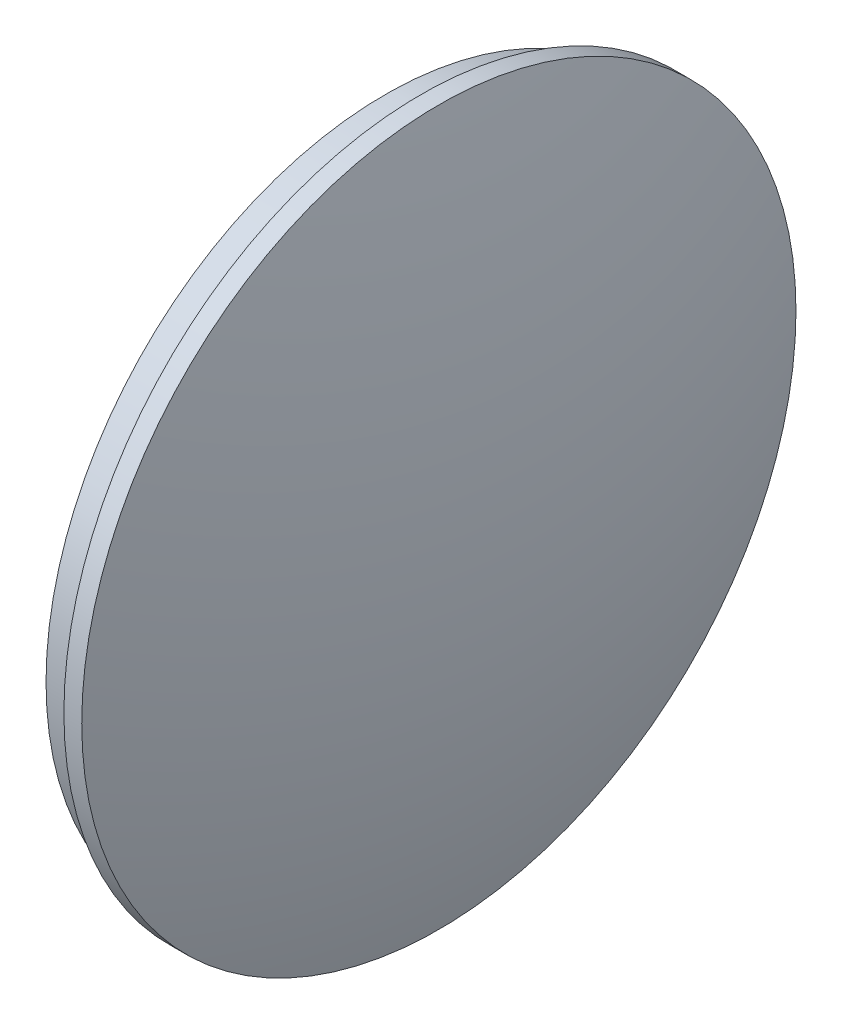
ISO-10303-21;
HEADER;
FILE_DESCRIPTION(('STEP AP214'),'2;1');
FILE_NAME('part.step','',(''),(''),'','','');
FILE_SCHEMA(('AUTOMOTIVE_DESIGN { 1 0 10303 214 1 1 1 1 }'));
ENDSEC;
DATA;
#1=APPLICATION_CONTEXT('core data for automotive mechanical design processes');
#2=APPLICATION_PROTOCOL_DEFINITION('international standard','automotive_design',2000,#1);
#3=PRODUCT_CONTEXT('',#1,'mechanical');
#4=PRODUCT('Part','Part','',(#3));
#5=PRODUCT_RELATED_PRODUCT_CATEGORY('part','',(#4));
#6=PRODUCT_DEFINITION_FORMATION('','',#4);
#7=PRODUCT_DEFINITION_CONTEXT('part definition',#1,'design');
#8=PRODUCT_DEFINITION('design','',#6,#7);
#9=PRODUCT_DEFINITION_SHAPE('','',#8);
#10=(LENGTH_UNIT() NAMED_UNIT(*) SI_UNIT(.MILLI.,.METRE.));
#11=(NAMED_UNIT(*) PLANE_ANGLE_UNIT() SI_UNIT($,.RADIAN.));
#12=(NAMED_UNIT(*) SI_UNIT($,.STERADIAN.) SOLID_ANGLE_UNIT());
#13=UNCERTAINTY_MEASURE_WITH_UNIT(LENGTH_MEASURE(1.E-05),#10,'distance_accuracy_value','');
#14=(GEOMETRIC_REPRESENTATION_CONTEXT(3) GLOBAL_UNCERTAINTY_ASSIGNED_CONTEXT((#13)) GLOBAL_UNIT_ASSIGNED_CONTEXT((#10,
#11,#12)) REPRESENTATION_CONTEXT('',''));
#15=CARTESIAN_POINT('',(0.,0.,0.));
#16=DIRECTION('',(0.,0.,1.));
#17=DIRECTION('',(1.,0.,0.));
#18=AXIS2_PLACEMENT_3D('',#15,#16,#17);
#19=CARTESIAN_POINT('',(-65.1666666666667,0.,0.));
#20=DIRECTION('',(0.,0.,1.));
#21=DIRECTION('',(1.,0.,0.));
#22=AXIS2_PLACEMENT_3D('',#19,#20,#21);
#23=SPHERICAL_SURFACE('',#22,68.1666666666667);
#24=CARTESIAN_POINT('',(-65.1666666666667,0.,0.));
#25=DIRECTION('',(-1.,0.,0.));
#26=DIRECTION('',(0.,0.,1.));
#27=AXIS2_PLACEMENT_3D('',#24,#25,#26);
#28=SPHERICAL_SURFACE('',#27,68.1666666666667);
#29=CARTESIAN_POINT('',(0.,0.,0.));
#30=DIRECTION('',(-1.,0.,0.));
#31=DIRECTION('',(0.,0.,1.));
#32=AXIS2_PLACEMENT_3D('',#29,#30,#31);
#33=CIRCLE('',#32,20.);
#34=CARTESIAN_POINT('',(0.,0.,20.));
#35=VERTEX_POINT('',#34);
#36=EDGE_CURVE('E10',#35,#35,#33,.T.);
#37=ORIENTED_EDGE('',*,*,#36,.F.);
#38=EDGE_LOOP('',(#37));
#39=FACE_BOUND('',#38,.T.);
#40=ADVANCED_FACE('F31',(#39),#28,.T.);
#41=CARTESIAN_POINT('',(-3.,0.,0.));
#42=DIRECTION('',(-1.,0.,0.));
#43=DIRECTION('',(0.,0.,1.));
#44=AXIS2_PLACEMENT_3D('',#41,#42,#43);
#45=CYLINDRICAL_SURFACE('',#44,20.);
#46=CARTESIAN_POINT('',(-1.,0.,0.));
#47=DIRECTION('',(-1.,0.,0.));
#48=DIRECTION('',(0.,0.,1.));
#49=AXIS2_PLACEMENT_3D('',#46,#47,#48);
#50=CIRCLE('',#49,20.);
#51=CARTESIAN_POINT('',(-1.,0.,20.));
#52=VERTEX_POINT('',#51);
#53=EDGE_CURVE('E37',#52,#52,#50,.T.);
#54=ORIENTED_EDGE('',*,*,#53,.F.);
#55=EDGE_LOOP('',(#54));
#56=FACE_BOUND('',#55,.T.);
#57=ORIENTED_EDGE('',*,*,#36,.T.);
#58=EDGE_LOOP('',(#57));
#59=FACE_BOUND('',#58,.T.);
#60=ADVANCED_FACE('F61',(#56,#59),#45,.T.);
#61=CARTESIAN_POINT('',(-1.,20.,0.));
#62=DIRECTION('',(1.,0.,0.));
#63=DIRECTION('',(0.,0.,-1.));
#64=AXIS2_PLACEMENT_3D('',#61,#62,#63);
#65=PLANE('',#64);
#66=CARTESIAN_POINT('',(-1.,0.,0.));
#67=DIRECTION('',(-1.,0.,0.));
#68=DIRECTION('',(0.,0.,1.));
#69=AXIS2_PLACEMENT_3D('',#66,#67,#68);
#70=CIRCLE('',#69,19.);
#71=CARTESIAN_POINT('',(-1.,0.,19.));
#72=VERTEX_POINT('',#71);
#73=EDGE_CURVE('E41',#72,#72,#70,.T.);
#74=ORIENTED_EDGE('',*,*,#73,.F.);
#75=EDGE_LOOP('',(#74));
#76=FACE_BOUND('',#75,.T.);
#77=ORIENTED_EDGE('',*,*,#53,.T.);
#78=EDGE_LOOP('',(#77));
#79=FACE_BOUND('',#78,.T.);
#80=ADVANCED_FACE('F56',(#76,#79),#65,.F.);
#81=CARTESIAN_POINT('',(-3.,0.,0.));
#82=DIRECTION('',(-1.,0.,0.));
#83=DIRECTION('',(0.,0.,1.));
#84=AXIS2_PLACEMENT_3D('',#81,#82,#83);
#85=CYLINDRICAL_SURFACE('',#84,19.);
#86=CARTESIAN_POINT('',(-3.,0.,0.));
#87=DIRECTION('',(-1.,0.,0.));
#88=DIRECTION('',(0.,0.,1.));
#89=AXIS2_PLACEMENT_3D('',#86,#87,#88);
#90=CIRCLE('',#89,19.);
#91=CARTESIAN_POINT('',(-3.,0.,19.));
#92=VERTEX_POINT('',#91);
#93=EDGE_CURVE('E45',#92,#92,#90,.T.);
#94=ORIENTED_EDGE('',*,*,#93,.F.);
#95=EDGE_LOOP('',(#94));
#96=FACE_BOUND('',#95,.T.);
#97=ORIENTED_EDGE('',*,*,#73,.T.);
#98=EDGE_LOOP('',(#97));
#99=FACE_BOUND('',#98,.T.);
#100=ADVANCED_FACE('F53',(#96,#99),#85,.T.);
#101=CARTESIAN_POINT('',(-3.,19.,0.));
#102=DIRECTION('',(1.,0.,0.));
#103=DIRECTION('',(0.,0.,-1.));
#104=AXIS2_PLACEMENT_3D('',#101,#102,#103);
#105=PLANE('',#104);
#106=ORIENTED_EDGE('',*,*,#93,.T.);
#107=EDGE_LOOP('',(#106));
#108=FACE_BOUND('',#107,.T.);
#109=ADVANCED_FACE('F51',(#108),#105,.F.);
#110=CLOSED_SHELL('',(#40,#60,#80,#100,#109));
#111=MANIFOLD_SOLID_BREP('B2',#110);
#112=ADVANCED_BREP_SHAPE_REPRESENTATION('',(#18,#111),#14);
#113=SHAPE_DEFINITION_REPRESENTATION(#9,#112);
ENDSEC;
END-ISO-10303-21;
